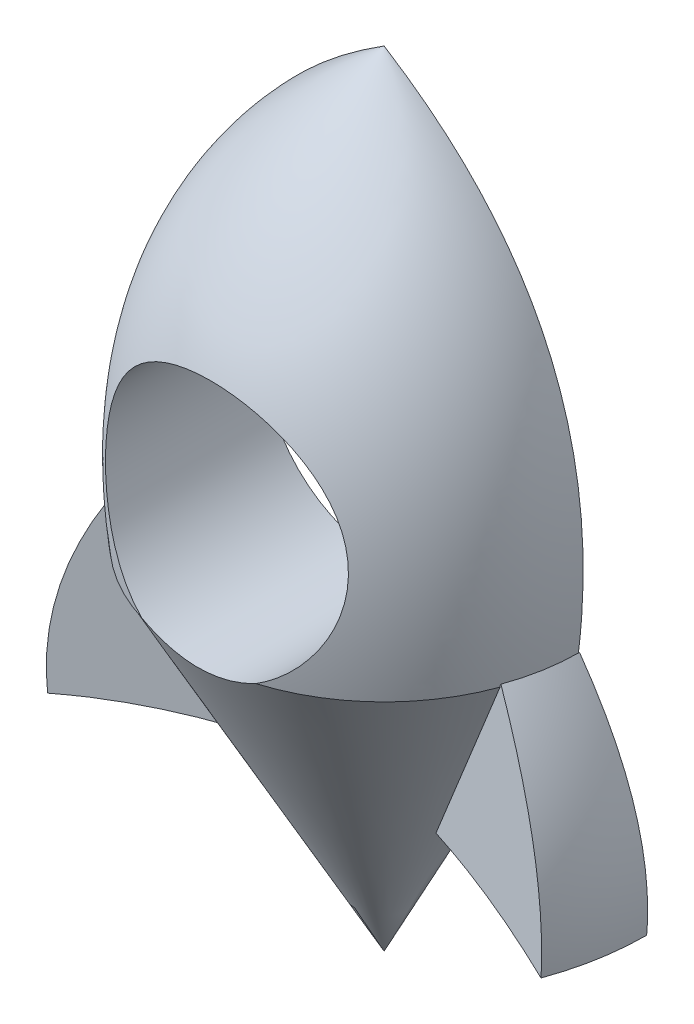
ISO-10303-21;
HEADER;
FILE_DESCRIPTION(('STEP AP214'),'2;1');
FILE_NAME('part.step','',(''),(''),'','','');
FILE_SCHEMA(('AUTOMOTIVE_DESIGN { 1 0 10303 214 1 1 1 1 }'));
ENDSEC;
DATA;
#1=APPLICATION_CONTEXT('core data for automotive mechanical design processes');
#2=APPLICATION_PROTOCOL_DEFINITION('international standard','automotive_design',2000,#1);
#3=PRODUCT_CONTEXT('',#1,'mechanical');
#4=PRODUCT('Part','Part','',(#3));
#5=PRODUCT_RELATED_PRODUCT_CATEGORY('part','',(#4));
#6=PRODUCT_DEFINITION_FORMATION('','',#4);
#7=PRODUCT_DEFINITION_CONTEXT('part definition',#1,'design');
#8=PRODUCT_DEFINITION('design','',#6,#7);
#9=PRODUCT_DEFINITION_SHAPE('','',#8);
#10=(LENGTH_UNIT() NAMED_UNIT(*) SI_UNIT(.MILLI.,.METRE.));
#11=(NAMED_UNIT(*) PLANE_ANGLE_UNIT() SI_UNIT($,.RADIAN.));
#12=(NAMED_UNIT(*) SI_UNIT($,.STERADIAN.) SOLID_ANGLE_UNIT());
#13=UNCERTAINTY_MEASURE_WITH_UNIT(LENGTH_MEASURE(1.E-05),#10,'distance_accuracy_value','');
#14=(GEOMETRIC_REPRESENTATION_CONTEXT(3) GLOBAL_UNCERTAINTY_ASSIGNED_CONTEXT((#13)) GLOBAL_UNIT_ASSIGNED_CONTEXT((#10,
#11,#12)) REPRESENTATION_CONTEXT('',''));
#15=CARTESIAN_POINT('',(0.,0.,0.));
#16=DIRECTION('',(0.,0.,1.));
#17=DIRECTION('',(1.,0.,0.));
#18=AXIS2_PLACEMENT_3D('',#15,#16,#17);
#19=CARTESIAN_POINT('',(37.0342723401185,16.7009626488539,-2.58608941546317E-13));
#20=DIRECTION('',(0.,1.,0.));
#21=DIRECTION('',(0.,0.,1.));
#22=AXIS2_PLACEMENT_3D('',#19,#20,#21);
#23=CONICAL_SURFACE('',#22,8.27231222622599,0.502523688872871);
#24=CARTESIAN_POINT('',(37.0342723401185,35.7486794001427,-2.58608941546317E-13));
#25=DIRECTION('',(0.,1.,0.));
#26=DIRECTION('',(0.,0.,1.));
#27=AXIS2_PLACEMENT_3D('',#24,#25,#26);
#28=CIRCLE('',#27,18.7406306013361);
#29=CARTESIAN_POINT('',(54.6447046250687,35.7486794001427,6.40967316428203));
#30=VERTEX_POINT('',#29);
#31=CARTESIAN_POINT('',(55.7749029414547,35.7486794001427,-4.1589995336544E-13));
#32=VERTEX_POINT('',#31);
#33=EDGE_CURVE('E284',#30,#32,#28,.T.);
#34=ORIENTED_EDGE('',*,*,#33,.T.);
#35=DIRECTION('',(-0.481638754868576,-0.876369847614948,0.));
#36=VECTOR('',#35,1.);
#37=CARTESIAN_POINT('',(37.0342723401185,1.64900735696894,-2.58608941546317E-13));
#38=LINE('',#37,#36);
#39=CARTESIAN_POINT('',(55.6514577680258,35.5240636965005,-1.30003111006641E-13));
#40=VERTEX_POINT('',#39);
#41=EDGE_CURVE('E59',#32,#40,#38,.T.);
#42=ORIENTED_EDGE('',*,*,#41,.T.);
#43=CARTESIAN_POINT('',(37.0342723401185,35.5240636964991,0.));
#44=DIRECTION('',(0.,-1.,0.));
#45=DIRECTION('',(0.,0.,-1.));
#46=AXIS2_PLACEMENT_3D('',#43,#44,#45);
#47=CIRCLE('',#46,18.6171854279071);
#48=CARTESIAN_POINT('',(54.5287041075115,35.5240637047659,6.367452428732));
#49=VERTEX_POINT('',#48);
#50=EDGE_CURVE('E277',#49,#40,#47,.F.);
#51=ORIENTED_EDGE('',*,*,#50,.F.);
#52=DIRECTION('',(0.452592383834515,0.876369847614949,0.164730155971344));
#53=VECTOR('',#52,1.);
#54=CARTESIAN_POINT('',(54.6447046250687,35.7486794001427,6.40967316428203));
#55=LINE('',#54,#53);
#56=EDGE_CURVE('E292',#49,#30,#55,.T.);
#57=ORIENTED_EDGE('',*,*,#56,.T.);
#58=EDGE_LOOP('',(#34,#42,#51,#57));
#59=FACE_BOUND('',#58,.T.);
#60=ADVANCED_FACE('F39',(#59),#23,.F.);
#61=CARTESIAN_POINT('',(60.6888140564156,15.4708227130461,8.60954908993986));
#62=CARTESIAN_POINT('',(53.0424364136359,17.262799719939,5.82649522800956));
#63=CARTESIAN_POINT('',(44.8077030959402,16.7009626488539,2.82929741324819));
#64=B_SPLINE_CURVE_WITH_KNOTS('',2,(#61,#62,#63),.UNSPECIFIED.,.F.,.F.,(3,3),(0.,
0.385925107106433),.UNSPECIFIED.);
#65=CARTESIAN_POINT('',(37.0342723401185,76.73235425994,-2.58608941546317E-13));
#66=DIRECTION('',(0.,1.,0.));
#67=AXIS1_PLACEMENT('',#65,#66);
#68=SURFACE_OF_REVOLUTION('',#64,#67);
#69=CARTESIAN_POINT('',(37.0342723401185,16.7040258281127,-2.58608941546317E-13));
#70=DIRECTION('',(0.,1.,0.));
#71=DIRECTION('',(0.,0.,1.));
#72=AXIS2_PLACEMENT_3D('',#69,#70,#71);
#73=CIRCLE('',#72,8.32036126448859);
#74=CARTESIAN_POINT('',(45.3546336046071,16.7040258281127,-3.17768307955373E-13));
#75=VERTEX_POINT('',#74);
#76=CARTESIAN_POINT('',(44.8528544250593,16.7040258328139,2.84573115308511));
#77=VERTEX_POINT('',#76);
#78=EDGE_CURVE('E281',#75,#77,#73,.F.);
#79=ORIENTED_EDGE('',*,*,#78,.F.);
#80=CARTESIAN_POINT('',(62.206909852706,15.4708227130461,-4.31946145518225E-13));
#81=CARTESIAN_POINT('',(54.0698047253032,17.262799719939,-3.7470027081099E-13));
#82=CARTESIAN_POINT('',(45.3065845663445,16.7009626488539,-3.17454396103756E-13));
#83=B_SPLINE_CURVE_WITH_KNOTS('',2,(#80,#81,#82),.UNSPECIFIED.,.F.,.F.,(3,3),(0.,
0.385925107106433),.UNSPECIFIED.);
#84=CARTESIAN_POINT('',(62.206909852706,15.4708227130461,-4.38885039422132E-13));
#85=VERTEX_POINT('',#84);
#86=EDGE_CURVE('E311',#75,#85,#83,.F.);
#87=ORIENTED_EDGE('',*,*,#86,.T.);
#88=CARTESIAN_POINT('',(37.0342723401185,15.4708227130461,-2.58608941546317E-13));
#89=DIRECTION('',(0.,1.,0.));
#90=DIRECTION('',(0.,0.,1.));
#91=AXIS2_PLACEMENT_3D('',#88,#89,#90);
#92=CIRCLE('',#91,25.1726375125875);
#93=CARTESIAN_POINT('',(60.6888140564156,15.4708227130461,8.60954908993986));
#94=VERTEX_POINT('',#93);
#95=EDGE_CURVE('E288',#94,#85,#92,.T.);
#96=ORIENTED_EDGE('',*,*,#95,.F.);
#97=EDGE_CURVE('E180',#94,#77,#64,.T.);
#98=ORIENTED_EDGE('',*,*,#97,.T.);
#99=EDGE_LOOP('',(#79,#87,#96,#98));
#100=FACE_BOUND('',#99,.T.);
#101=ADVANCED_FACE('F194',(#100),#68,.F.);
#102=CARTESIAN_POINT('',(54.6447046250687,35.7486794001427,6.40967316428203));
#103=CARTESIAN_POINT('',(61.5277514696091,25.4371458218792,8.91489733675459));
#104=CARTESIAN_POINT('',(60.6888140564156,15.4708227130461,8.60954908993986));
#105=B_SPLINE_CURVE_WITH_KNOTS('',2,(#102,#103,#104),.UNSPECIFIED.,.F.,.F.,(3,3),(0.,
0.565089792484632),.UNSPECIFIED.);
#106=CARTESIAN_POINT('',(37.0342723401185,76.73235425994,-2.58608941546317E-13));
#107=DIRECTION('',(0.,1.,0.));
#108=AXIS1_PLACEMENT('',#106,#107);
#109=SURFACE_OF_REVOLUTION('',#105,#108);
#110=ORIENTED_EDGE('',*,*,#95,.T.);
#111=CARTESIAN_POINT('',(55.7749029414547,35.7486794001427,-3.90312782094782E-13));
#112=CARTESIAN_POINT('',(63.099688400325,25.4371458218792,-4.44089209850063E-13));
#113=CARTESIAN_POINT('',(62.206909852706,15.4708227130461,-4.38885039422132E-13));
#114=B_SPLINE_CURVE_WITH_KNOTS('',2,(#111,#112,#113),.UNSPECIFIED.,.F.,.F.,(3,3),(0.,
0.565089792484632),.UNSPECIFIED.);
#115=EDGE_CURVE('E305',#85,#32,#114,.F.);
#116=ORIENTED_EDGE('',*,*,#115,.T.);
#117=ORIENTED_EDGE('',*,*,#33,.F.);
#118=EDGE_CURVE('E170',#30,#94,#105,.T.);
#119=ORIENTED_EDGE('',*,*,#118,.T.);
#120=EDGE_LOOP('',(#110,#116,#117,#119));
#121=FACE_BOUND('',#120,.T.);
#122=ADVANCED_FACE('F189',(#121),#109,.F.);
#123=CARTESIAN_POINT('',(29.2608415842969,16.7009626488539,-2.82929741324871));
#124=CARTESIAN_POINT('',(21.0261082666011,17.262799719939,-5.82649522801008));
#125=CARTESIAN_POINT('',(13.3797306238215,15.4708227130461,-8.60954908994038));
#126=B_SPLINE_CURVE_WITH_KNOTS('',2,(#123,#124,#125),.UNSPECIFIED.,.F.,.F.,(3,3),(0.,
0.385925107106433),.UNSPECIFIED.);
#127=CARTESIAN_POINT('',(37.0342723401185,76.73235425994,-2.58608941546317E-13));
#128=DIRECTION('',(0.,1.,0.));
#129=AXIS1_PLACEMENT('',#127,#128);
#130=SURFACE_OF_REVOLUTION('',#126,#129);
#131=CARTESIAN_POINT('',(28.7619601138925,16.7009626488539,-2.0122792321331E-13));
#132=CARTESIAN_POINT('',(19.9987399549339,17.262799719939,-1.43982048506075E-13));
#133=CARTESIAN_POINT('',(11.8616348275311,15.4708227130461,0.));
#134=B_SPLINE_CURVE_WITH_KNOTS('',2,(#131,#132,#133),.UNSPECIFIED.,.F.,.F.,(3,3),(0.,
0.385925107106433),.UNSPECIFIED.);
#135=CARTESIAN_POINT('',(28.7139110756303,16.7040258281127,-2.00914037442878E-13));
#136=VERTEX_POINT('',#135);
#137=CARTESIAN_POINT('',(11.8616348275311,15.4708227130461,0.));
#138=VERTEX_POINT('',#137);
#139=EDGE_CURVE('E65',#136,#138,#134,.T.);
#140=ORIENTED_EDGE('',*,*,#139,.F.);
#141=CARTESIAN_POINT('',(37.0342723401185,16.7040258281127,-2.58608941546317E-13));
#142=DIRECTION('',(0.,1.,0.));
#143=DIRECTION('',(0.,0.,1.));
#144=AXIS2_PLACEMENT_3D('',#141,#142,#143);
#145=CIRCLE('',#144,8.32036126448841);
#146=CARTESIAN_POINT('',(29.2156902482219,16.7040258287457,2.84573115561698));
#147=VERTEX_POINT('',#146);
#148=EDGE_CURVE('E162',#136,#147,#145,.T.);
#149=ORIENTED_EDGE('',*,*,#148,.T.);
#150=CARTESIAN_POINT('',(29.2608415842969,16.7009626488539,2.8292974132483));
#151=CARTESIAN_POINT('',(21.0261082666012,17.262799719939,5.82649522800978));
#152=CARTESIAN_POINT('',(13.3797306238216,15.4708227130461,8.6095490899402));
#153=B_SPLINE_CURVE_WITH_KNOTS('',2,(#150,#151,#152),.UNSPECIFIED.,.F.,.F.,(3,3),(0.,
0.385925107106433),.UNSPECIFIED.);
#154=CARTESIAN_POINT('',(13.3797306238216,15.4708227130461,8.6095490899402));
#155=VERTEX_POINT('',#154);
#156=EDGE_CURVE('E146',#147,#155,#153,.T.);
#157=ORIENTED_EDGE('',*,*,#156,.T.);
#158=CARTESIAN_POINT('',(37.0342723401185,15.4708227130461,-2.58608941546317E-13));
#159=DIRECTION('',(0.,1.,0.));
#160=DIRECTION('',(0.,0.,1.));
#161=AXIS2_PLACEMENT_3D('',#158,#159,#160);
#162=CIRCLE('',#161,25.1726375125875);
#163=EDGE_CURVE('E145',#138,#155,#162,.T.);
#164=ORIENTED_EDGE('',*,*,#163,.F.);
#165=EDGE_LOOP('',(#140,#149,#157,#164));
#166=FACE_BOUND('',#165,.T.);
#167=ADVANCED_FACE('F193',(#166),#130,.T.);
#168=CARTESIAN_POINT('',(37.0342723401185,35.7486794001427,-2.58608941546317E-13));
#169=DIRECTION('',(0.,1.,0.));
#170=DIRECTION('',(0.,0.,1.));
#171=AXIS2_PLACEMENT_3D('',#168,#169,#170);
#172=CONICAL_SURFACE('',#171,18.7406306013361,0.502523688872871);
#173=DIRECTION('',(-0.481638754868576,0.876369847614948,0.));
#174=VECTOR('',#173,1.);
#175=CARTESIAN_POINT('',(37.0342723401185,1.64900735696895,-2.58608941546317E-13));
#176=LINE('',#175,#174);
#177=CARTESIAN_POINT('',(18.2936417387824,35.7486794001427,-1.31838984174237E-13));
#178=VERTEX_POINT('',#177);
#179=CARTESIAN_POINT('',(18.4170869084788,35.5240637032908,-1.28605830513612E-13));
#180=VERTEX_POINT('',#179);
#181=EDGE_CURVE('E125',#178,#180,#176,.F.);
#182=ORIENTED_EDGE('',*,*,#181,.F.);
#183=CARTESIAN_POINT('',(37.0342723401185,35.7486794001427,-2.58608941546317E-13));
#184=DIRECTION('',(0.,1.,0.));
#185=DIRECTION('',(0.,0.,1.));
#186=AXIS2_PLACEMENT_3D('',#183,#184,#185);
#187=CIRCLE('',#186,18.7406306013361);
#188=CARTESIAN_POINT('',(19.4238400551684,35.7486794001427,6.40967316428228));
#189=VERTEX_POINT('',#188);
#190=EDGE_CURVE('E133',#178,#189,#187,.T.);
#191=ORIENTED_EDGE('',*,*,#190,.T.);
#192=DIRECTION('',(0.452592383834512,-0.876369847614949,-0.16473015597135));
#193=VECTOR('',#192,1.);
#194=CARTESIAN_POINT('',(19.4238400551684,35.7486794001427,6.40967316428228));
#195=LINE('',#194,#193);
#196=CARTESIAN_POINT('',(19.5398405702038,35.524063703291,6.36745242964987));
#197=VERTEX_POINT('',#196);
#198=EDGE_CURVE('E152',#189,#197,#195,.T.);
#199=ORIENTED_EDGE('',*,*,#198,.T.);
#200=CARTESIAN_POINT('',(37.0342723401185,35.5240636964991,0.));
#201=DIRECTION('',(0.,-1.,0.));
#202=DIRECTION('',(0.,0.,-1.));
#203=AXIS2_PLACEMENT_3D('',#200,#201,#202);
#204=CIRCLE('',#203,18.6171854279071);
#205=EDGE_CURVE('E136',#197,#180,#204,.T.);
#206=ORIENTED_EDGE('',*,*,#205,.T.);
#207=EDGE_LOOP('',(#182,#191,#199,#206));
#208=FACE_BOUND('',#207,.T.);
#209=ADVANCED_FACE('F131',(#208),#172,.F.);
#210=CARTESIAN_POINT('',(13.3797306238215,15.4708227130461,-8.60954908994038));
#211=CARTESIAN_POINT('',(12.540793210628,25.4371458218792,-8.91489733675511));
#212=CARTESIAN_POINT('',(19.4238400551683,35.7486794001427,-6.40967316428255));
#213=B_SPLINE_CURVE_WITH_KNOTS('',2,(#210,#211,#212),.UNSPECIFIED.,.F.,.F.,(3,3),(0.,
0.565089792484632),.UNSPECIFIED.);
#214=CARTESIAN_POINT('',(37.0342723401185,76.73235425994,-2.58608941546317E-13));
#215=DIRECTION('',(0.,1.,0.));
#216=AXIS1_PLACEMENT('',#214,#215);
#217=SURFACE_OF_REVOLUTION('',#213,#216);
#218=CARTESIAN_POINT('',(11.8616348275311,15.4708227130461,0.));
#219=CARTESIAN_POINT('',(10.9688562799121,25.4371458218792,0.));
#220=CARTESIAN_POINT('',(18.2936417387824,35.7486794001427,-1.31838984174237E-13));
#221=B_SPLINE_CURVE_WITH_KNOTS('',2,(#218,#219,#220),.UNSPECIFIED.,.F.,.F.,(3,3),(0.,
0.565089792484632),.UNSPECIFIED.);
#222=EDGE_CURVE('E11',#138,#178,#221,.T.);
#223=ORIENTED_EDGE('',*,*,#222,.F.);
#224=ORIENTED_EDGE('',*,*,#163,.T.);
#225=CARTESIAN_POINT('',(13.3797306238216,15.4708227130461,8.6095490899402));
#226=CARTESIAN_POINT('',(12.5407932106281,25.4371458218792,8.91489733675494));
#227=CARTESIAN_POINT('',(19.4238400551684,35.7486794001427,6.40967316428228));
#228=B_SPLINE_CURVE_WITH_KNOTS('',2,(#225,#226,#227),.UNSPECIFIED.,.F.,.F.,(3,3),(0.,
0.565089792484632),.UNSPECIFIED.);
#229=EDGE_CURVE('E143',#155,#189,#228,.T.);
#230=ORIENTED_EDGE('',*,*,#229,.T.);
#231=ORIENTED_EDGE('',*,*,#190,.F.);
#232=EDGE_LOOP('',(#223,#224,#230,#231));
#233=FACE_BOUND('',#232,.T.);
#234=ADVANCED_FACE('F141',(#233),#217,.T.);
#235=CARTESIAN_POINT('',(37.0342723401185,76.73235425994,0.));
#236=CARTESIAN_POINT('',(59.1737720515778,62.9056236442152,-1.54599300187766E-13));
#237=CARTESIAN_POINT('',(55.6374141880631,35.4141457299887,-1.299050452119E-13));
#238=B_SPLINE_CURVE_WITH_KNOTS('',2,(#235,#236,#237),.UNSPECIFIED.,.F.,.F.,(3,3),(0.,1.),.UNSPECIFIED.);
#239=CARTESIAN_POINT('',(37.0342723401185,57.2578834837988,0.));
#240=DIRECTION('',(0.,-1.,0.));
#241=AXIS1_PLACEMENT('',#239,#240);
#242=SURFACE_OF_REVOLUTION('',#238,#241);
#243=ORIENTED_EDGE('',*,*,#205,.F.);
#244=CARTESIAN_POINT('',(37.0342723401185,76.73235425994,0.));
#245=CARTESIAN_POINT('',(16.2299478333686,62.9056236442152,7.57215486447208));
#246=CARTESIAN_POINT('',(19.5530372221716,35.4141457299887,6.36264924114189));
#247=B_SPLINE_CURVE_WITH_KNOTS('',2,(#244,#245,#246),.UNSPECIFIED.,.F.,.F.,(3,3),(0.,1.),.UNSPECIFIED.);
#248=CARTESIAN_POINT('',(19.5530372221715,35.4141457299887,6.36264924114164));
#249=VERTEX_POINT('',#248);
#250=EDGE_CURVE('E165',#249,#197,#247,.F.);
#251=ORIENTED_EDGE('',*,*,#250,.F.);
#252=CARTESIAN_POINT('',(37.0342723401185,35.4141457299887,0.));
#253=DIRECTION('',(0.,-1.,0.));
#254=DIRECTION('',(0.,0.,-1.));
#255=AXIS2_PLACEMENT_3D('',#252,#253,#254);
#256=CIRCLE('',#255,18.6031418479445);
#257=CARTESIAN_POINT('',(31.5613801159825,35.4141457299887,17.7798857509754));
#258=VERTEX_POINT('',#257);
#259=EDGE_CURVE('E249',#258,#249,#256,.T.);
#260=ORIENTED_EDGE('',*,*,#259,.F.);
#261=CARTESIAN_POINT('',(31.5613801159825,35.4141457299887,17.7798857509754));
#262=CARTESIAN_POINT('',(31.2643165938014,35.5729533145386,17.7098500040195));
#263=CARTESIAN_POINT('',(30.9750617256427,35.7442502384965,17.6353891261772));
#264=CARTESIAN_POINT('',(30.413844492857,36.1101981097015,17.4795884767251));
#265=CARTESIAN_POINT('',(30.1418752802655,36.3048397192633,17.3982514593323));
#266=CARTESIAN_POINT('',(29.6167651001022,36.7159032077191,17.230642847572));
#267=CARTESIAN_POINT('',(29.3636170096992,36.9323167733248,17.1443731420665));
#268=CARTESIAN_POINT('',(28.8773330438236,37.38551757321,16.9688887659357));
#269=CARTESIAN_POINT('',(28.6441991956577,37.6223068665591,16.8796737982396));
#270=CARTESIAN_POINT('',(28.1994429591232,38.1145400366798,16.7004684429715));
#271=CARTESIAN_POINT('',(27.9877986589441,38.369964445892,16.6104789488368));
#272=CARTESIAN_POINT('',(27.5869469231475,38.8982545742901,16.4317363383383));
#273=CARTESIAN_POINT('',(27.3977391253718,39.1711200118426,16.3429832020383));
#274=CARTESIAN_POINT('',(27.0428786977566,39.7329685448711,16.1687944620946));
#275=CARTESIAN_POINT('',(26.8772371679304,40.021959146875,16.0833604354753));
#276=CARTESIAN_POINT('',(26.5709334476965,40.6142182164425,15.9180217145614));
#277=CARTESIAN_POINT('',(26.4302584674272,40.9174792722153,15.8381142020239));
#278=CARTESIAN_POINT('',(26.1740351985282,41.5391150106724,15.68525090823));
#279=CARTESIAN_POINT('',(26.0586948018118,41.8575903951079,15.6123552163661));
#280=CARTESIAN_POINT('',(25.8558475110264,42.5053239483713,15.4762389188148));
#281=CARTESIAN_POINT('',(25.768340864092,42.8345822129113,15.4130183990354));
#282=CARTESIAN_POINT('',(25.6224062803934,43.5011782699757,15.2980666244631));
#283=CARTESIAN_POINT('',(25.563954678175,43.8385092517088,15.246326038299));
#284=CARTESIAN_POINT('',(25.477009281304,44.5187069390645,15.1556737739362));
#285=CARTESIAN_POINT('',(25.4485122345562,44.8615730396477,15.1167607033994));
#286=CARTESIAN_POINT('',(25.4233033973903,45.5189519123386,15.055527372412));
#287=CARTESIAN_POINT('',(25.4239765128556,45.8332576175807,15.0320342705084));
#288=CARTESIAN_POINT('',(25.4508956268566,46.4614204540837,14.9966779273567));
#289=CARTESIAN_POINT('',(25.4771400418081,46.775277611917,14.9848139660283));
#290=CARTESIAN_POINT('',(25.5550933403566,47.4000031321041,14.9725414149283));
#291=CARTESIAN_POINT('',(25.6067998993193,47.7108717646623,14.9721317796006));
#292=CARTESIAN_POINT('',(25.7352721447574,48.3272014130137,14.982174360627));
#293=CARTESIAN_POINT('',(25.8120376614458,48.6326624654311,14.9926265033881));
#294=CARTESIAN_POINT('',(25.9855270618799,49.2208505002362,15.0226715048874));
#295=CARTESIAN_POINT('',(26.0810680317403,49.5039524713882,15.0417837485848));
#296=CARTESIAN_POINT('',(26.2934232679551,50.0613762675037,15.0878986697829));
#297=CARTESIAN_POINT('',(26.4102366018774,50.3356984766912,15.1149010014684));
#298=CARTESIAN_POINT('',(26.6642794296443,50.8739451430674,15.1755814479147));
#299=CARTESIAN_POINT('',(26.8015092112866,51.1378694536171,15.2092596567832));
#300=CARTESIAN_POINT('',(27.0954961187318,51.6539467420893,15.2819886051515));
#301=CARTESIAN_POINT('',(27.2522603148324,51.9060954122689,15.3210412904296));
#302=CARTESIAN_POINT('',(27.5934418002335,52.4107359970681,15.4054087659266));
#303=CARTESIAN_POINT('',(27.7789064522277,52.6624823159761,15.4509499610994));
#304=CARTESIAN_POINT('',(28.1692416166949,53.1498903420801,15.5448756040887));
#305=CARTESIAN_POINT('',(28.3741130319989,53.3855513000832,15.5932601841439));
#306=CARTESIAN_POINT('',(28.8021162323674,53.8395767230988,15.6913100493232));
#307=CARTESIAN_POINT('',(29.0252560681474,54.0579334779893,15.7409758924123));
#308=CARTESIAN_POINT('',(29.4883514066655,54.4759306207799,15.8400192938592));
#309=CARTESIAN_POINT('',(29.728301656608,54.675576810039,15.8893969370931));
#310=CARTESIAN_POINT('',(30.2374554305059,55.0655668322084,15.9891093407382));
#311=CARTESIAN_POINT('',(30.5075430613027,55.2547834947097,16.0393457105884));
#312=CARTESIAN_POINT('',(31.0633050868001,55.6098146658394,16.1362817942171));
#313=CARTESIAN_POINT('',(31.3489801030316,55.7756282403467,16.182981366792));
#314=CARTESIAN_POINT('',(31.9340174216341,56.0825696940576,16.2713618264294));
#315=CARTESIAN_POINT('',(32.2333784594282,56.2236998481971,16.3130431758836));
#316=CARTESIAN_POINT('',(32.8437575402787,56.4801192007313,16.3900736324782));
#317=CARTESIAN_POINT('',(33.1547751994533,56.5954092492342,16.4254229479271));
#318=CARTESIAN_POINT('',(33.7807262667756,56.7973439570091,16.4881143903143));
#319=CARTESIAN_POINT('',(34.0954968977655,56.8844529414121,16.5155853602212));
#320=CARTESIAN_POINT('',(34.7318382761756,57.0319258049276,16.5624761968119));
#321=CARTESIAN_POINT('',(35.0534089762338,57.0922898702524,16.5818961195512));
#322=CARTESIAN_POINT('',(35.7008162473071,57.1856721176501,16.6120704927215));
#323=CARTESIAN_POINT('',(36.0266516771763,57.2186974689092,16.6228272149328));
#324=CARTESIAN_POINT('',(36.6801158220588,57.2570945139123,16.6353422104596));
#325=CARTESIAN_POINT('',(37.0077444762895,57.2624671392263,16.6371007869064));
#326=CARTESIAN_POINT('',(37.647798965962,57.2458818426883,16.6316878007328));
#327=CARTESIAN_POINT('',(37.960259725966,57.2251154924785,16.6249055730514));
#328=CARTESIAN_POINT('',(38.5821973585003,57.1584583017515,16.6032665706193));
#329=CARTESIAN_POINT('',(38.8916743279972,57.1125682805169,16.588410059171));
#330=CARTESIAN_POINT('',(39.5054658835879,56.9960800124638,16.5510507989217));
#331=CARTESIAN_POINT('',(39.8097804737983,56.9254817853483,16.5285480562181));
#332=CARTESIAN_POINT('',(40.4111782508154,56.7601897992047,16.4765386951843));
#333=CARTESIAN_POINT('',(40.7082613238107,56.6654956612172,16.447031966702));
#334=CARTESIAN_POINT('',(41.2937921146281,56.4525934008708,16.381787888674));
#335=CARTESIAN_POINT('',(41.5822228912507,56.3343422230478,16.3460391455266));
#336=CARTESIAN_POINT('',(42.1480743373893,56.0753465724811,16.2693523443308));
#337=CARTESIAN_POINT('',(42.4254950481608,55.9346021840306,16.2284143057295));
#338=CARTESIAN_POINT('',(42.9676912477396,55.631614752649,16.1424905976908));
#339=CARTESIAN_POINT('',(43.2324661138724,55.4693706525655,16.0975047292544));
#340=CARTESIAN_POINT('',(43.7479295857128,55.1243999543872,16.0047332775187));
#341=CARTESIAN_POINT('',(43.998613120362,54.9416660525658,15.9569466988032));
#342=CARTESIAN_POINT('',(44.4952277122629,54.5482958428033,15.8577856214454));
#343=CARTESIAN_POINT('',(44.7404487336746,54.3367788204104,15.8063461424539));
#344=CARTESIAN_POINT('',(45.2123888520981,53.8939887643165,15.7035600159543));
#345=CARTESIAN_POINT('',(45.4391071887932,53.662714919562,15.6522133723457));
#346=CARTESIAN_POINT('',(45.8727091456325,53.1817049297395,15.5513192659041));
#347=CARTESIAN_POINT('',(46.079583987857,52.9319606998807,15.501772605273));
#348=CARTESIAN_POINT('',(46.4719393606313,52.4156896402114,15.4063046381717));
#349=CARTESIAN_POINT('',(46.6574278904972,52.1491691434235,15.3603819782251));
#350=CARTESIAN_POINT('',(47.0088302613491,51.5960726316949,15.2731856439821));
#351=CARTESIAN_POINT('',(47.1743441230368,51.3092270136203,15.2320075386873));
#352=CARTESIAN_POINT('',(47.4806021171697,50.7216479297997,15.1571164624427));
#353=CARTESIAN_POINT('',(47.621345802179,50.4209142133099,15.1234036263389));
#354=CARTESIAN_POINT('',(47.8767433274054,49.8078769143336,15.0652167495212));
#355=CARTESIAN_POINT('',(47.9914112156913,49.4955796675407,15.0407377294779));
#356=CARTESIAN_POINT('',(48.1936556997368,48.8616930360573,15.0025395092645));
#357=CARTESIAN_POINT('',(48.2812342819282,48.5401043345915,14.988819520032));
#358=CARTESIAN_POINT('',(48.424194283525,47.9091111168483,14.9738005784194));
#359=CARTESIAN_POINT('',(48.4811447385935,47.6000774398119,14.9718292192447));
#360=CARTESIAN_POINT('',(48.5697883410921,46.9785433954821,14.9791803191133));
#361=CARTESIAN_POINT('',(48.6014825243077,46.6660431708883,14.9885023149649));
#362=CARTESIAN_POINT('',(48.6394415864213,46.0401320223442,15.0187021660758));
#363=CARTESIAN_POINT('',(48.6457121004826,45.7267213156161,15.0395774593775));
#364=CARTESIAN_POINT('',(48.6329764052353,45.1013913452939,15.0927208144377));
#365=CARTESIAN_POINT('',(48.6139705624263,44.7894720601405,15.1249887110019));
#366=CARTESIAN_POINT('',(48.5526078446595,44.1842635837622,15.198545717351));
#367=CARTESIAN_POINT('',(48.511406404261,43.8907947140689,15.2393318913766));
#368=CARTESIAN_POINT('',(48.4070343230548,43.3092265067298,15.3299160839596));
#369=CARTESIAN_POINT('',(48.343864554873,43.0211269562828,15.379713744525));
#370=CARTESIAN_POINT('',(48.1962577019019,42.4519546161662,15.4872940119756));
#371=CARTESIAN_POINT('',(48.1118196418771,42.1708821493662,15.5450769849641));
#372=CARTESIAN_POINT('',(47.9224282789105,41.6171322311949,15.6674520438107));
#373=CARTESIAN_POINT('',(47.817465704731,41.3444586383961,15.7320472007394));
#374=CARTESIAN_POINT('',(47.5812401059206,40.793451948688,15.8706071932225));
#375=CARTESIAN_POINT('',(47.4488079880169,40.5157019439524,15.9448977390697));
#376=CARTESIAN_POINT('',(47.1629204747699,39.9725313126113,16.0979835214328));
#377=CARTESIAN_POINT('',(47.0094635760224,39.7071115695162,16.1767790798504));
#378=CARTESIAN_POINT('',(46.6824538997068,39.1897694012635,16.3372335852304));
#379=CARTESIAN_POINT('',(46.5088959904821,38.9378504468856,16.4188932596568));
#380=CARTESIAN_POINT('',(46.1426519641374,38.4487149083122,16.5833999278519));
#381=CARTESIAN_POINT('',(45.9499641546743,38.2114996279107,16.6662470261114));
#382=CARTESIAN_POINT('',(45.5206654016817,37.7236614487,16.8420134453011));
#383=CARTESIAN_POINT('',(45.2815862292927,37.4751815923085,16.9348710640061));
#384=CARTESIAN_POINT('',(44.7816900273315,36.9999701570918,17.1176750279607));
#385=CARTESIAN_POINT('',(44.5208728504725,36.7732387256466,17.2076213534791));
#386=CARTESIAN_POINT('',(43.9786712662073,36.3429495133243,17.3824260797989));
#387=CARTESIAN_POINT('',(43.6972654435967,36.1394164413631,17.4672790108625));
#388=CARTESIAN_POINT('',(43.1157746533118,35.7574751504243,17.6296433720514));
#389=CARTESIAN_POINT('',(42.8156836650986,35.5790750905846,17.707152415408));
#390=CARTESIAN_POINT('',(42.5071645642548,35.4141457299887,17.7798857509753));
#391=B_SPLINE_CURVE_WITH_KNOTS('',3,(#261,#262,#263,#264,#265,#266,#267,#268,#269,#270,#271,
#272,#273,#274,#275,#276,#277,#278,#279,#280,#281,#282,#283,#284,#285,#286,#287,#288,#289,#290,
#291,#292,#293,#294,#295,#296,#297,#298,#299,#300,#301,#302,#303,#304,#305,#306,#307,#308,#309,
#310,#311,#312,#313,#314,#315,#316,#317,#318,#319,#320,#321,#322,#323,#324,#325,#326,#327,#328,
#329,#330,#331,#332,#333,#334,#335,#336,#337,#338,#339,#340,#341,#342,#343,#344,#345,#346,#347,
#348,#349,#350,#351,#352,#353,#354,#355,#356,#357,#358,#359,#360,#361,#362,#363,#364,#365,#366,
#367,#368,#369,#370,#371,#372,#373,#374,#375,#376,#377,#378,#379,#380,#381,#382,#383,#384,#385,
#386,#387,#388,#389,#390),.UNSPECIFIED.,.F.,.F.,(4,2,2,2,2,2,2,2,2,2,2,2,2,2,2,2,2,2,2,2,2,2,2,
2,2,2,2,2,2,2,2,2,2,2,2,2,2,2,2,2,2,2,2,2,2,2,2,2,2,2,2,2,2,2,2,2,2,2,2,2,2,2,2,2,4),(0.,
1.03170425842219,2.06299721120478,3.0938978644666,4.12490281804411,5.1548457218725,
6.1847719986394,7.21518178912211,8.24506218808376,9.28310166737851,10.3211503631168,
11.3583521727851,12.3954413642746,13.339766175217,14.2840325095464,15.2282126505371,
16.1723863943722,17.0695879846455,17.9667502573187,18.8639251779164,19.7614257709109,
20.7083453625416,21.6553090279104,22.602692280806,23.5497808114073,24.5493101249261,
25.5488793228114,26.5483563472672,27.5478004853118,28.5298218088281,29.5118362948876,
30.4935931800606,31.4753169914098,32.4138658276841,33.3523840597173,34.2909015433495,
35.2294337880749,36.1696974021152,37.1099574925964,38.0502638333389,38.9909064245256,
39.9734817468706,40.9560974251231,41.9391457854201,42.9218252461117,43.9217248300974,
44.9216424739119,45.9210201393232,46.9203245039878,47.8618407468552,48.8033183751859,
49.7445873133248,50.6858426034953,51.5822618670168,52.4786455270427,53.3750702972989,
54.2719009357041,55.2205424609466,56.1692518554698,57.1182039854047,58.0672401401404,
59.1372034485396,60.2071740071139,61.2782737626666,62.3497204408569),.UNSPECIFIED.);
#392=CARTESIAN_POINT('',(42.5071645642548,35.4141457299887,17.7798857509753));
#393=VERTEX_POINT('',#392);
#394=EDGE_CURVE('E218',#258,#393,#391,.T.);
#395=ORIENTED_EDGE('',*,*,#394,.T.);
#396=CARTESIAN_POINT('',(54.5155074580657,35.4141457299887,6.3626492411414));
#397=VERTEX_POINT('',#396);
#398=EDGE_CURVE('E250',#397,#393,#256,.T.);
#399=ORIENTED_EDGE('',*,*,#398,.F.);
#400=CARTESIAN_POINT('',(37.0342723401185,76.73235425994,0.));
#401=CARTESIAN_POINT('',(57.8385968468686,62.9056236442152,7.57215486447177));
#402=CARTESIAN_POINT('',(54.5155074580656,35.4141457299887,6.36264924114163));
#403=B_SPLINE_CURVE_WITH_KNOTS('',2,(#400,#401,#402),.UNSPECIFIED.,.F.,.F.,(3,3),(0.,1.),.UNSPECIFIED.);
#404=EDGE_CURVE('E275',#397,#49,#403,.F.);
#405=ORIENTED_EDGE('',*,*,#404,.T.);
#406=ORIENTED_EDGE('',*,*,#50,.T.);
#407=CARTESIAN_POINT('',(37.0342723401185,76.73235425994,0.));
#408=VERTEX_POINT('',#407);
#409=EDGE_CURVE('E236',#408,#40,#238,.T.);
#410=ORIENTED_EDGE('',*,*,#409,.F.);
#411=CARTESIAN_POINT('',(37.0342723401185,76.73235425994,0.));
#412=CARTESIAN_POINT('',(14.8947726286593,62.9056236442152,0.));
#413=CARTESIAN_POINT('',(18.431130492174,35.4141457299887,0.));
#414=B_SPLINE_CURVE_WITH_KNOTS('',2,(#411,#412,#413),.UNSPECIFIED.,.F.,.F.,(3,3),(0.,1.),.UNSPECIFIED.);
#415=EDGE_CURVE('E226',#408,#180,#414,.T.);
#416=ORIENTED_EDGE('',*,*,#415,.T.);
#417=EDGE_LOOP('',(#243,#251,#260,#395,#399,#405,#406,#410,#416));
#418=FACE_BOUND('',#417,.T.);
#419=ADVANCED_FACE('F41',(#418),#242,.T.);
#420=CARTESIAN_POINT('',(37.0342723401185,35.4141457299887,0.));
#421=DIRECTION('',(0.,1.,0.));
#422=DIRECTION('',(0.,0.,1.));
#423=AXIS2_PLACEMENT_3D('',#420,#421,#422);
#424=CONICAL_SURFACE('',#423,18.6031418479445,0.502523688872871);
#425=ORIENTED_EDGE('',*,*,#148,.F.);
#426=DIRECTION('',(0.481638754868576,-0.876369847614948,0.));
#427=VECTOR('',#426,1.);
#428=CARTESIAN_POINT('',(37.0342723401185,1.56464250450372,0.));
#429=LINE('',#428,#427);
#430=CARTESIAN_POINT('',(37.0342723401185,1.56464250450372,0.));
#431=VERTEX_POINT('',#430);
#432=EDGE_CURVE('E231',#136,#431,#429,.T.);
#433=ORIENTED_EDGE('',*,*,#432,.T.);
#434=DIRECTION('',(-0.481638754868576,-0.876369847614948,0.));
#435=VECTOR('',#434,1.);
#436=CARTESIAN_POINT('',(37.0342723401185,1.56464250450372,0.));
#437=LINE('',#436,#435);
#438=EDGE_CURVE('E242',#75,#431,#437,.T.);
#439=ORIENTED_EDGE('',*,*,#438,.F.);
#440=ORIENTED_EDGE('',*,*,#78,.T.);
#441=DIRECTION('',(0.452592383834515,0.876369847614949,0.164730155971344));
#442=VECTOR('',#441,1.);
#443=CARTESIAN_POINT('',(37.0342723401186,1.56464250450371,-2.26584852077649E-13));
#444=LINE('',#443,#442);
#445=EDGE_CURVE('E253',#77,#397,#444,.T.);
#446=ORIENTED_EDGE('',*,*,#445,.T.);
#447=ORIENTED_EDGE('',*,*,#398,.T.);
#448=CARTESIAN_POINT('',(42.7565985504132,35.5514676348321,17.780481429101));
#449=CARTESIAN_POINT('',(42.6146697058484,35.4710469357649,17.7797302446846));
#450=CARTESIAN_POINT('',(42.471061668299,35.393628037796,17.7797132217166));
#451=CARTESIAN_POINT('',(42.1807185366746,35.2449134922486,17.7808484153265));
#452=CARTESIAN_POINT('',(42.0339835298941,35.1736176740132,17.782000599306));
#453=CARTESIAN_POINT('',(41.589519049418,34.9691320061868,17.7867613440387));
#454=CARTESIAN_POINT('',(41.2874378391938,34.8452916735163,17.7916739985858));
#455=CARTESIAN_POINT('',(40.67451929255,34.6237008995475,17.8028459569571));
#456=CARTESIAN_POINT('',(40.363698052251,34.5259055783987,17.8091029102647));
#457=CARTESIAN_POINT('',(39.734917813916,34.3567766360607,17.8212437373014));
#458=CARTESIAN_POINT('',(39.4169588113467,34.2854430316782,17.8271276107936));
#459=CARTESIAN_POINT('',(38.7758894889755,34.1697036709124,17.8372342584842));
#460=CARTESIAN_POINT('',(38.4527752583857,34.1253194630182,17.8414557024742));
#461=CARTESIAN_POINT('',(37.8039347265133,34.0638885958283,17.8474124967353));
#462=CARTESIAN_POINT('',(37.4782084325785,34.0468418596582,17.8491478539976));
#463=CARTESIAN_POINT('',(36.8264329964287,34.0402120896833,17.8498151420885));
#464=CARTESIAN_POINT('',(36.5003838202567,34.0506323411862,17.8487467375612));
#465=CARTESIAN_POINT('',(35.8503344679838,34.0988648631784,17.8440007711911));
#466=CARTESIAN_POINT('',(35.5263343539634,34.1366779596181,17.8403231306745));
#467=CARTESIAN_POINT('',(34.8636952196433,34.2424587737908,17.8307811285715));
#468=CARTESIAN_POINT('',(34.5253194216116,34.3120729770659,17.8248006211941));
#469=CARTESIAN_POINT('',(33.8561233448573,34.4811586611073,17.8121130441827));
#470=CARTESIAN_POINT('',(33.5253035806021,34.5806321684206,17.8054059252535));
#471=CARTESIAN_POINT('',(32.8730376458827,34.8089434659429,17.7932327546556));
#472=CARTESIAN_POINT('',(32.5516141823247,34.9378466665621,17.787769522501));
#473=CARTESIAN_POINT('',(32.079123574173,35.1523093418867,17.7823904476903));
#474=CARTESIAN_POINT('',(31.923211295061,35.2273278169607,17.781066731177));
#475=CARTESIAN_POINT('',(31.6148855392382,35.3842608189696,17.7797140673733));
#476=CARTESIAN_POINT('',(31.4624721705507,35.4661755584522,17.7796851600045));
#477=CARTESIAN_POINT('',(31.3119461298242,35.5514676348321,17.7804814291011));
#478=B_SPLINE_CURVE_WITH_KNOTS('',3,(#448,#449,#450,#451,#452,#453,#454,#455,#456,#457,#458,
#459,#460,#461,#462,#463,#464,#465,#466,#467,#468,#469,#470,#471,#472,#473,#474,#475,#476,#477),
.UNSPECIFIED.,.F.,.F.,(4,2,2,2,2,2,2,2,2,2,2,2,2,2,4),(0.,0.489313210897491,0.97861277967145,
1.95689480345515,2.93348001588977,3.91006584858325,4.88743152551178,5.86479445403441,
6.84227428957614,7.81978359936367,8.85492754440405,9.89014176041492,10.9276796365488,
11.4466054979107,11.9655473587921),.UNSPECIFIED.);
#479=EDGE_CURVE('E211',#393,#258,#478,.T.);
#480=ORIENTED_EDGE('',*,*,#479,.T.);
#481=ORIENTED_EDGE('',*,*,#259,.T.);
#482=DIRECTION('',(-0.452592383834512,0.876369847614949,0.16473015597135));
#483=VECTOR('',#482,1.);
#484=CARTESIAN_POINT('',(37.0342723401185,1.56464250450371,-2.28214958927127E-13));
#485=LINE('',#484,#483);
#486=EDGE_CURVE('E52',#147,#249,#485,.T.);
#487=ORIENTED_EDGE('',*,*,#486,.F.);
#488=EDGE_LOOP('',(#425,#433,#439,#440,#446,#447,#480,#481,#487));
#489=FACE_BOUND('',#488,.T.);
#490=ADVANCED_FACE('F267',(#489),#424,.T.);
#491=CARTESIAN_POINT('',(37.0342723401185,45.650405082677,0.));
#492=DIRECTION('',(0.,0.,-1.));
#493=DIRECTION('',(-1.,0.,0.));
#494=AXIS2_PLACEMENT_3D('',#491,#492,#493);
#495=PLANE('',#494);
#496=ORIENTED_EDGE('',*,*,#409,.T.);
#497=ORIENTED_EDGE('',*,*,#41,.F.);
#498=ORIENTED_EDGE('',*,*,#115,.F.);
#499=ORIENTED_EDGE('',*,*,#86,.F.);
#500=ORIENTED_EDGE('',*,*,#438,.T.);
#501=ORIENTED_EDGE('',*,*,#432,.F.);
#502=ORIENTED_EDGE('',*,*,#139,.T.);
#503=ORIENTED_EDGE('',*,*,#222,.T.);
#504=ORIENTED_EDGE('',*,*,#181,.T.);
#505=ORIENTED_EDGE('',*,*,#415,.F.);
#506=EDGE_LOOP('',(#496,#497,#498,#499,#500,#501,#502,#503,#504,#505));
#507=FACE_BOUND('',#506,.T.);
#508=CARTESIAN_POINT('',(37.0342723401185,45.650405082677,-2.58608941546317E-13));
#509=DIRECTION('',(0.,0.,-1.));
#510=DIRECTION('',(-1.,0.,0.));
#511=AXIS2_PLACEMENT_3D('',#508,#509,#510);
#512=CIRCLE('',#511,11.6074784011218);
#513=CARTESIAN_POINT('',(25.4267939389968,45.650405082677,-1.77554353089234E-13));
#514=VERTEX_POINT('',#513);
#515=EDGE_CURVE('E272',#514,#514,#512,.T.);
#516=ORIENTED_EDGE('',*,*,#515,.F.);
#517=EDGE_LOOP('',(#516));
#518=FACE_BOUND('',#517,.T.);
#519=ADVANCED_FACE('F123',(#507,#518),#495,.T.);
#520=CARTESIAN_POINT('',(37.0342723401187,45.650405082677,29.9999999999997));
#521=DIRECTION('',(0.,0.,-1.));
#522=DIRECTION('',(-1.,0.,0.));
#523=AXIS2_PLACEMENT_3D('',#520,#521,#522);
#524=CYLINDRICAL_SURFACE('',#523,11.6074784011218);
#525=ORIENTED_EDGE('',*,*,#515,.T.);
#526=EDGE_LOOP('',(#525));
#527=FACE_BOUND('',#526,.T.);
#528=ORIENTED_EDGE('',*,*,#479,.F.);
#529=ORIENTED_EDGE('',*,*,#394,.F.);
#530=EDGE_LOOP('',(#528,#529));
#531=FACE_BOUND('',#530,.T.);
#532=ADVANCED_FACE('F204',(#527,#531),#524,.F.);
#533=CARTESIAN_POINT('',(59.5972554051756,25.5234484392368,8.21225423193277));
#534=DIRECTION('',(-0.342020143325663,0.,0.93969262078591));
#535=DIRECTION('',(0.93969262078591,0.,0.342020143325663));
#536=AXIS2_PLACEMENT_3D('',#533,#534,#535);
#537=PLANE('',#536);
#538=ORIENTED_EDGE('',*,*,#404,.F.);
#539=ORIENTED_EDGE('',*,*,#445,.F.);
#540=ORIENTED_EDGE('',*,*,#97,.F.);
#541=ORIENTED_EDGE('',*,*,#118,.F.);
#542=ORIENTED_EDGE('',*,*,#56,.F.);
#543=EDGE_LOOP('',(#538,#539,#540,#541,#542));
#544=FACE_BOUND('',#543,.T.);
#545=ADVANCED_FACE('F196',(#544),#537,.T.);
#546=CARTESIAN_POINT('',(14.4712892750616,25.5234484392368,8.21225423193309));
#547=DIRECTION('',(-0.342020143325676,0.,-0.939692620785906));
#548=DIRECTION('',(-0.939692620785906,0.,0.342020143325676));
#549=AXIS2_PLACEMENT_3D('',#546,#547,#548);
#550=PLANE('',#549);
#551=ORIENTED_EDGE('',*,*,#486,.T.);
#552=ORIENTED_EDGE('',*,*,#250,.T.);
#553=ORIENTED_EDGE('',*,*,#198,.F.);
#554=ORIENTED_EDGE('',*,*,#229,.F.);
#555=ORIENTED_EDGE('',*,*,#156,.F.);
#556=EDGE_LOOP('',(#551,#552,#553,#554,#555));
#557=FACE_BOUND('',#556,.T.);
#558=ADVANCED_FACE('F260',(#557),#550,.F.);
#559=CLOSED_SHELL('',(#60,#101,#122,#167,#209,#234,#419,#490,#519,#532,#545,#558));
#560=MANIFOLD_SOLID_BREP('B2',#559);
#561=ADVANCED_BREP_SHAPE_REPRESENTATION('',(#18,#560),#14);
#562=SHAPE_DEFINITION_REPRESENTATION(#9,#561);
ENDSEC;
END-ISO-10303-21;
